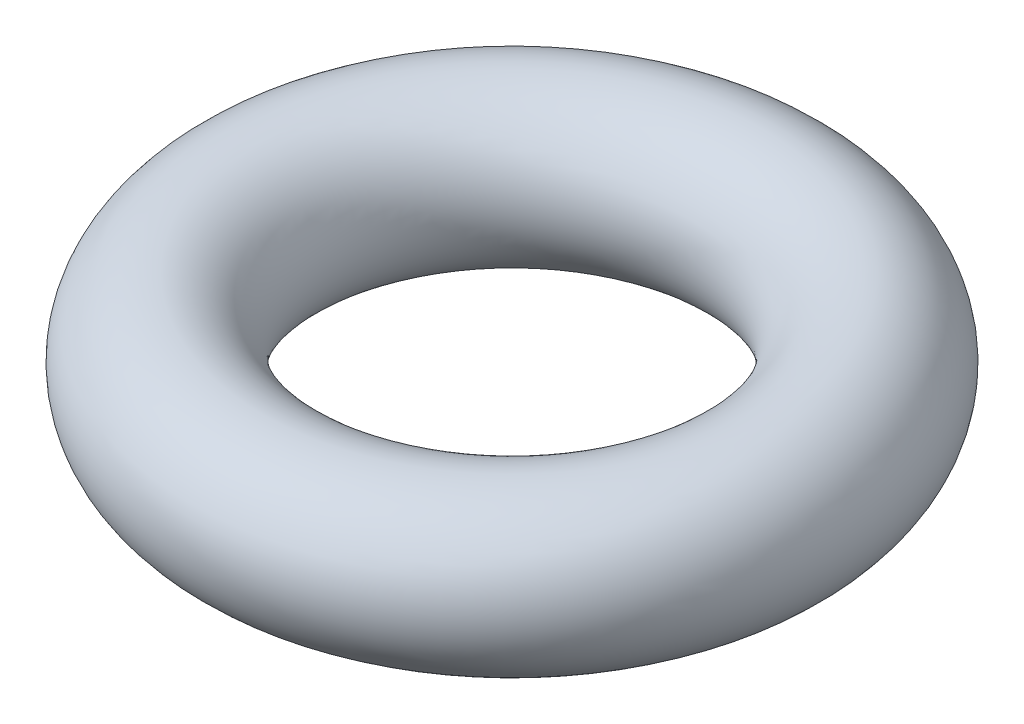
ISO-10303-21;
HEADER;
FILE_DESCRIPTION(('STEP AP214'),'2;1');
FILE_NAME('part.step','',(''),(''),'','','');
FILE_SCHEMA(('AUTOMOTIVE_DESIGN { 1 0 10303 214 1 1 1 1 }'));
ENDSEC;
DATA;
#1=APPLICATION_CONTEXT('core data for automotive mechanical design processes');
#2=APPLICATION_PROTOCOL_DEFINITION('international standard','automotive_design',2000,#1);
#3=PRODUCT_CONTEXT('',#1,'mechanical');
#4=PRODUCT('Part','Part','',(#3));
#5=PRODUCT_RELATED_PRODUCT_CATEGORY('part','',(#4));
#6=PRODUCT_DEFINITION_FORMATION('','',#4);
#7=PRODUCT_DEFINITION_CONTEXT('part definition',#1,'design');
#8=PRODUCT_DEFINITION('design','',#6,#7);
#9=PRODUCT_DEFINITION_SHAPE('','',#8);
#10=(LENGTH_UNIT() NAMED_UNIT(*) SI_UNIT(.MILLI.,.METRE.));
#11=(NAMED_UNIT(*) PLANE_ANGLE_UNIT() SI_UNIT($,.RADIAN.));
#12=(NAMED_UNIT(*) SI_UNIT($,.STERADIAN.) SOLID_ANGLE_UNIT());
#13=UNCERTAINTY_MEASURE_WITH_UNIT(LENGTH_MEASURE(1.E-05),#10,'distance_accuracy_value','');
#14=(GEOMETRIC_REPRESENTATION_CONTEXT(3) GLOBAL_UNCERTAINTY_ASSIGNED_CONTEXT((#13)) GLOBAL_UNIT_ASSIGNED_CONTEXT((#10,
#11,#12)) REPRESENTATION_CONTEXT('',''));
#15=CARTESIAN_POINT('',(0.,0.,0.));
#16=DIRECTION('',(0.,0.,1.));
#17=DIRECTION('',(1.,0.,0.));
#18=AXIS2_PLACEMENT_3D('',#15,#16,#17);
#19=CARTESIAN_POINT('',(0.,0.,0.));
#20=DIRECTION('',(0.,-1.,0.));
#21=DIRECTION('',(0.,0.,-1.));
#22=AXIS2_PLACEMENT_3D('',#19,#20,#21);
#23=TOROIDAL_SURFACE('',#22,8.,2.5);
#24=ADVANCED_FACE('F14',(),#23,.T.);
#25=CLOSED_SHELL('',(#24));
#26=MANIFOLD_SOLID_BREP('B1',#25);
#27=ADVANCED_BREP_SHAPE_REPRESENTATION('',(#18,#26),#14);
#28=SHAPE_DEFINITION_REPRESENTATION(#9,#27);
ENDSEC;
END-ISO-10303-21;
